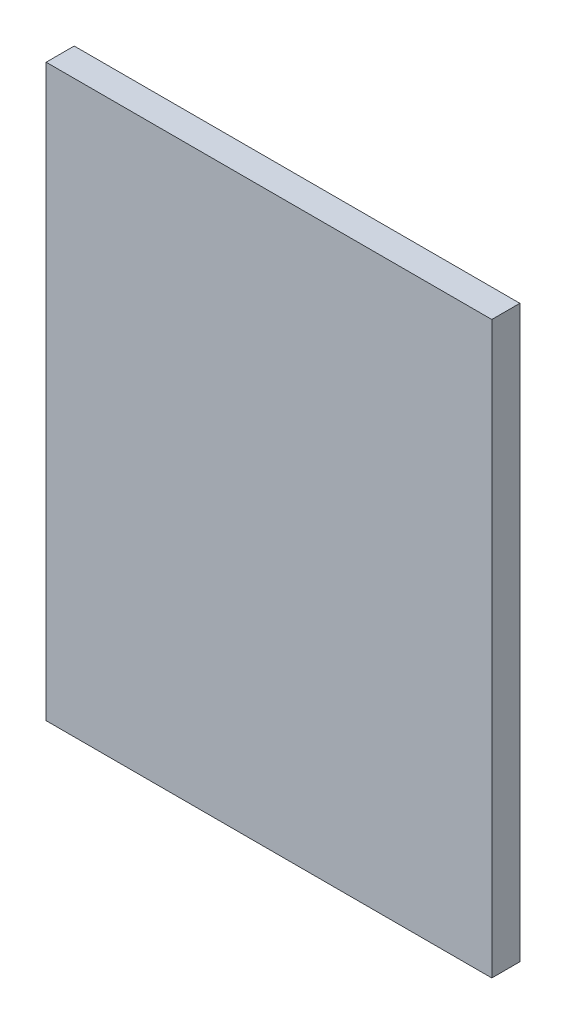
ISO-10303-21;
HEADER;
FILE_DESCRIPTION(('STEP AP214'),'2;1');
FILE_NAME('part.step','',(''),(''),'','','');
FILE_SCHEMA(('AUTOMOTIVE_DESIGN { 1 0 10303 214 1 1 1 1 }'));
ENDSEC;
DATA;
#1=APPLICATION_CONTEXT('core data for automotive mechanical design processes');
#2=APPLICATION_PROTOCOL_DEFINITION('international standard','automotive_design',2000,#1);
#3=PRODUCT_CONTEXT('',#1,'mechanical');
#4=PRODUCT('Part','Part','',(#3));
#5=PRODUCT_RELATED_PRODUCT_CATEGORY('part','',(#4));
#6=PRODUCT_DEFINITION_FORMATION('','',#4);
#7=PRODUCT_DEFINITION_CONTEXT('part definition',#1,'design');
#8=PRODUCT_DEFINITION('design','',#6,#7);
#9=PRODUCT_DEFINITION_SHAPE('','',#8);
#10=(LENGTH_UNIT() NAMED_UNIT(*) SI_UNIT(.MILLI.,.METRE.));
#11=(NAMED_UNIT(*) PLANE_ANGLE_UNIT() SI_UNIT($,.RADIAN.));
#12=(NAMED_UNIT(*) SI_UNIT($,.STERADIAN.) SOLID_ANGLE_UNIT());
#13=UNCERTAINTY_MEASURE_WITH_UNIT(LENGTH_MEASURE(1.E-05),#10,'distance_accuracy_value','');
#14=(GEOMETRIC_REPRESENTATION_CONTEXT(3) GLOBAL_UNCERTAINTY_ASSIGNED_CONTEXT((#13)) GLOBAL_UNIT_ASSIGNED_CONTEXT((#10,
#11,#12)) REPRESENTATION_CONTEXT('',''));
#15=CARTESIAN_POINT('',(0.,0.,0.));
#16=DIRECTION('',(0.,0.,1.));
#17=DIRECTION('',(1.,0.,0.));
#18=AXIS2_PLACEMENT_3D('',#15,#16,#17);
#19=CARTESIAN_POINT('',(-143.,-183.,18.));
#20=DIRECTION('',(0.,1.,0.));
#21=DIRECTION('',(0.,0.,1.));
#22=AXIS2_PLACEMENT_3D('',#19,#20,#21);
#23=PLANE('',#22);
#24=DIRECTION('',(1.,0.,0.));
#25=VECTOR('',#24,1.);
#26=CARTESIAN_POINT('',(-143.,-183.,0.));
#27=LINE('',#26,#25);
#28=CARTESIAN_POINT('',(-143.,-183.,0.));
#29=VERTEX_POINT('',#28);
#30=CARTESIAN_POINT('',(143.,-183.,0.));
#31=VERTEX_POINT('',#30);
#32=EDGE_CURVE('E96',#29,#31,#27,.T.);
#33=ORIENTED_EDGE('',*,*,#32,.T.);
#34=DIRECTION('',(0.,0.,-1.));
#35=VECTOR('',#34,1.);
#36=CARTESIAN_POINT('',(143.,-183.,18.));
#37=LINE('',#36,#35);
#38=CARTESIAN_POINT('',(143.,-183.,18.));
#39=VERTEX_POINT('',#38);
#40=EDGE_CURVE('E11',#39,#31,#37,.T.);
#41=ORIENTED_EDGE('',*,*,#40,.F.);
#42=DIRECTION('',(1.,0.,0.));
#43=VECTOR('',#42,1.);
#44=CARTESIAN_POINT('',(-143.,-183.,18.));
#45=LINE('',#44,#43);
#46=CARTESIAN_POINT('',(-143.,-183.,18.));
#47=VERTEX_POINT('',#46);
#48=EDGE_CURVE('E84',#47,#39,#45,.T.);
#49=ORIENTED_EDGE('',*,*,#48,.F.);
#50=DIRECTION('',(0.,0.,-1.));
#51=VECTOR('',#50,1.);
#52=CARTESIAN_POINT('',(-143.,-183.,18.));
#53=LINE('',#52,#51);
#54=EDGE_CURVE('E92',#47,#29,#53,.T.);
#55=ORIENTED_EDGE('',*,*,#54,.T.);
#56=EDGE_LOOP('',(#33,#41,#49,#55));
#57=FACE_BOUND('',#56,.T.);
#58=ADVANCED_FACE('F33',(#57),#23,.F.);
#59=CARTESIAN_POINT('',(143.,-183.,18.));
#60=DIRECTION('',(-1.,0.,0.));
#61=DIRECTION('',(0.,0.,1.));
#62=AXIS2_PLACEMENT_3D('',#59,#60,#61);
#63=PLANE('',#62);
#64=DIRECTION('',(0.,1.,0.));
#65=VECTOR('',#64,1.);
#66=CARTESIAN_POINT('',(143.,-183.,0.));
#67=LINE('',#66,#65);
#68=CARTESIAN_POINT('',(143.,183.,0.));
#69=VERTEX_POINT('',#68);
#70=EDGE_CURVE('E88',#31,#69,#67,.T.);
#71=ORIENTED_EDGE('',*,*,#70,.T.);
#72=DIRECTION('',(0.,0.,-1.));
#73=VECTOR('',#72,1.);
#74=CARTESIAN_POINT('',(143.,183.,18.));
#75=LINE('',#74,#73);
#76=CARTESIAN_POINT('',(143.,183.,18.));
#77=VERTEX_POINT('',#76);
#78=EDGE_CURVE('E41',#77,#69,#75,.T.);
#79=ORIENTED_EDGE('',*,*,#78,.F.);
#80=DIRECTION('',(0.,1.,0.));
#81=VECTOR('',#80,1.);
#82=CARTESIAN_POINT('',(143.,-183.,18.));
#83=LINE('',#82,#81);
#84=EDGE_CURVE('E79',#39,#77,#83,.T.);
#85=ORIENTED_EDGE('',*,*,#84,.F.);
#86=ORIENTED_EDGE('',*,*,#40,.T.);
#87=EDGE_LOOP('',(#71,#79,#85,#86));
#88=FACE_BOUND('',#87,.T.);
#89=ADVANCED_FACE('F87',(#88),#63,.F.);
#90=CARTESIAN_POINT('',(143.,183.,18.));
#91=DIRECTION('',(0.,-1.,0.));
#92=DIRECTION('',(0.,0.,-1.));
#93=AXIS2_PLACEMENT_3D('',#90,#91,#92);
#94=PLANE('',#93);
#95=DIRECTION('',(-1.,0.,0.));
#96=VECTOR('',#95,1.);
#97=CARTESIAN_POINT('',(143.,183.,0.));
#98=LINE('',#97,#96);
#99=CARTESIAN_POINT('',(-143.,183.,0.));
#100=VERTEX_POINT('',#99);
#101=EDGE_CURVE('E66',#69,#100,#98,.T.);
#102=ORIENTED_EDGE('',*,*,#101,.T.);
#103=DIRECTION('',(0.,0.,-1.));
#104=VECTOR('',#103,1.);
#105=CARTESIAN_POINT('',(-143.,183.,18.));
#106=LINE('',#105,#104);
#107=CARTESIAN_POINT('',(-143.,183.,18.));
#108=VERTEX_POINT('',#107);
#109=EDGE_CURVE('E89',#108,#100,#106,.T.);
#110=ORIENTED_EDGE('',*,*,#109,.F.);
#111=DIRECTION('',(-1.,0.,0.));
#112=VECTOR('',#111,1.);
#113=CARTESIAN_POINT('',(143.,183.,18.));
#114=LINE('',#113,#112);
#115=EDGE_CURVE('E82',#77,#108,#114,.T.);
#116=ORIENTED_EDGE('',*,*,#115,.F.);
#117=ORIENTED_EDGE('',*,*,#78,.T.);
#118=EDGE_LOOP('',(#102,#110,#116,#117));
#119=FACE_BOUND('',#118,.T.);
#120=ADVANCED_FACE('F90',(#119),#94,.F.);
#121=CARTESIAN_POINT('',(-143.,183.,18.));
#122=DIRECTION('',(1.,0.,0.));
#123=DIRECTION('',(0.,0.,-1.));
#124=AXIS2_PLACEMENT_3D('',#121,#122,#123);
#125=PLANE('',#124);
#126=DIRECTION('',(0.,-1.,0.));
#127=VECTOR('',#126,1.);
#128=CARTESIAN_POINT('',(-143.,183.,0.));
#129=LINE('',#128,#127);
#130=EDGE_CURVE('E72',#100,#29,#129,.T.);
#131=ORIENTED_EDGE('',*,*,#130,.T.);
#132=ORIENTED_EDGE('',*,*,#54,.F.);
#133=DIRECTION('',(0.,-1.,0.));
#134=VECTOR('',#133,1.);
#135=CARTESIAN_POINT('',(-143.,183.,18.));
#136=LINE('',#135,#134);
#137=EDGE_CURVE('E49',#108,#47,#136,.T.);
#138=ORIENTED_EDGE('',*,*,#137,.F.);
#139=ORIENTED_EDGE('',*,*,#109,.T.);
#140=EDGE_LOOP('',(#131,#132,#138,#139));
#141=FACE_BOUND('',#140,.T.);
#142=ADVANCED_FACE('F103',(#141),#125,.F.);
#143=CARTESIAN_POINT('',(0.,0.,18.));
#144=DIRECTION('',(0.,0.,1.));
#145=DIRECTION('',(1.,0.,0.));
#146=AXIS2_PLACEMENT_3D('',#143,#144,#145);
#147=PLANE('',#146);
#148=ORIENTED_EDGE('',*,*,#48,.T.);
#149=ORIENTED_EDGE('',*,*,#84,.T.);
#150=ORIENTED_EDGE('',*,*,#115,.T.);
#151=ORIENTED_EDGE('',*,*,#137,.T.);
#152=EDGE_LOOP('',(#148,#149,#150,#151));
#153=FACE_BOUND('',#152,.T.);
#154=ADVANCED_FACE('F80',(#153),#147,.T.);
#155=CARTESIAN_POINT('',(0.,0.,0.));
#156=DIRECTION('',(0.,0.,1.));
#157=DIRECTION('',(1.,0.,0.));
#158=AXIS2_PLACEMENT_3D('',#155,#156,#157);
#159=PLANE('',#158);
#160=ORIENTED_EDGE('',*,*,#32,.F.);
#161=ORIENTED_EDGE('',*,*,#130,.F.);
#162=ORIENTED_EDGE('',*,*,#101,.F.);
#163=ORIENTED_EDGE('',*,*,#70,.F.);
#164=EDGE_LOOP('',(#160,#161,#162,#163));
#165=FACE_BOUND('',#164,.T.);
#166=ADVANCED_FACE('F106',(#165),#159,.F.);
#167=CLOSED_SHELL('',(#58,#89,#120,#142,#154,#166));
#168=MANIFOLD_SOLID_BREP('B2',#167);
#169=ADVANCED_BREP_SHAPE_REPRESENTATION('',(#18,#168),#14);
#170=SHAPE_DEFINITION_REPRESENTATION(#9,#169);
ENDSEC;
END-ISO-10303-21;
